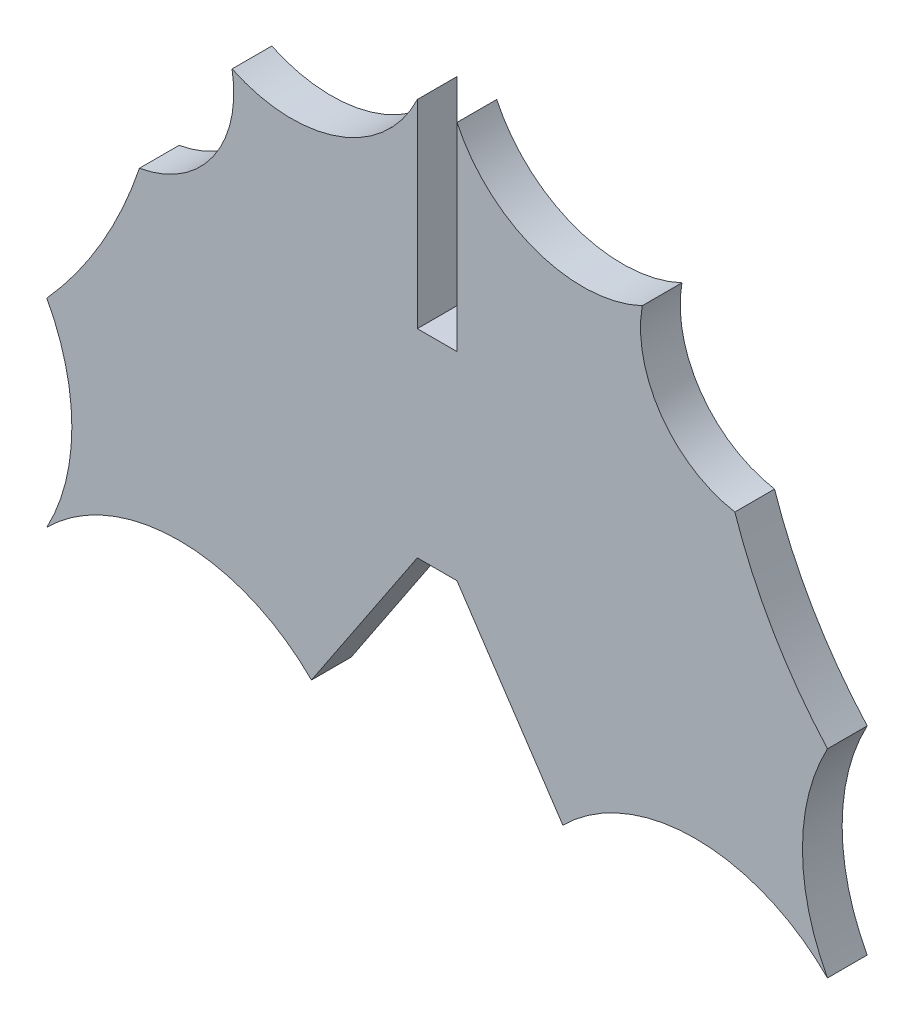
ISO-10303-21;
HEADER;
FILE_DESCRIPTION(('STEP AP214'),'2;1');
FILE_NAME('part.step','',(''),(''),'','','');
FILE_SCHEMA(('AUTOMOTIVE_DESIGN { 1 0 10303 214 1 1 1 1 }'));
ENDSEC;
DATA;
#1=APPLICATION_CONTEXT('core data for automotive mechanical design processes');
#2=APPLICATION_PROTOCOL_DEFINITION('international standard','automotive_design',2000,#1);
#3=PRODUCT_CONTEXT('',#1,'mechanical');
#4=PRODUCT('Part','Part','',(#3));
#5=PRODUCT_RELATED_PRODUCT_CATEGORY('part','',(#4));
#6=PRODUCT_DEFINITION_FORMATION('','',#4);
#7=PRODUCT_DEFINITION_CONTEXT('part definition',#1,'design');
#8=PRODUCT_DEFINITION('design','',#6,#7);
#9=PRODUCT_DEFINITION_SHAPE('','',#8);
#10=(LENGTH_UNIT() NAMED_UNIT(*) SI_UNIT(.MILLI.,.METRE.));
#11=(NAMED_UNIT(*) PLANE_ANGLE_UNIT() SI_UNIT($,.RADIAN.));
#12=(NAMED_UNIT(*) SI_UNIT($,.STERADIAN.) SOLID_ANGLE_UNIT());
#13=UNCERTAINTY_MEASURE_WITH_UNIT(LENGTH_MEASURE(1.E-05),#10,'distance_accuracy_value','');
#14=(GEOMETRIC_REPRESENTATION_CONTEXT(3) GLOBAL_UNCERTAINTY_ASSIGNED_CONTEXT((#13)) GLOBAL_UNIT_ASSIGNED_CONTEXT((#10,
#11,#12)) REPRESENTATION_CONTEXT('',''));
#15=CARTESIAN_POINT('',(0.,0.,0.));
#16=DIRECTION('',(0.,0.,1.));
#17=DIRECTION('',(1.,0.,0.));
#18=AXIS2_PLACEMENT_3D('',#15,#16,#17);
#19=CARTESIAN_POINT('',(-7.01661778192691,0.,3.));
#20=DIRECTION('',(1.,0.,0.));
#21=DIRECTION('',(0.,1.,0.));
#22=AXIS2_PLACEMENT_3D('',#19,#20,#21);
#23=PLANE('',#22);
#24=DIRECTION('',(0.,0.,-1.));
#25=VECTOR('',#24,1.);
#26=CARTESIAN_POINT('',(-7.01661778192691,12.6227024904081,3.));
#27=LINE('',#26,#25);
#28=CARTESIAN_POINT('',(-7.01661778192691,12.6227024904081,3.));
#29=VERTEX_POINT('',#28);
#30=CARTESIAN_POINT('',(-7.01661778192691,12.6227024904081,0.));
#31=VERTEX_POINT('',#30);
#32=EDGE_CURVE('E12',#29,#31,#27,.T.);
#33=ORIENTED_EDGE('',*,*,#32,.F.);
#34=DIRECTION('',(0.,-1.,0.));
#35=VECTOR('',#34,1.);
#36=CARTESIAN_POINT('',(-7.01661778192691,0.,3.));
#37=LINE('',#36,#35);
#38=CARTESIAN_POINT('',(-7.01661778192691,27.6227024904081,3.));
#39=VERTEX_POINT('',#38);
#40=EDGE_CURVE('E238',#39,#29,#37,.T.);
#41=ORIENTED_EDGE('',*,*,#40,.F.);
#42=DIRECTION('',(0.,0.,-1.));
#43=VECTOR('',#42,1.);
#44=CARTESIAN_POINT('',(-7.01661778192691,27.6227024904081,3.));
#45=LINE('',#44,#43);
#46=CARTESIAN_POINT('',(-7.01661778192691,27.6227024904081,0.));
#47=VERTEX_POINT('',#46);
#48=EDGE_CURVE('E273',#39,#47,#45,.T.);
#49=ORIENTED_EDGE('',*,*,#48,.T.);
#50=DIRECTION('',(0.,-1.,0.));
#51=VECTOR('',#50,1.);
#52=CARTESIAN_POINT('',(-7.01661778192691,0.,0.));
#53=LINE('',#52,#51);
#54=EDGE_CURVE('E252',#47,#31,#53,.T.);
#55=ORIENTED_EDGE('',*,*,#54,.T.);
#56=EDGE_LOOP('',(#33,#41,#49,#55));
#57=FACE_BOUND('',#56,.T.);
#58=ADVANCED_FACE('F104',(#57),#23,.F.);
#59=CARTESIAN_POINT('',(10.9833822180731,-24.3772975095919,3.));
#60=DIRECTION('',(0.,0.,-1.));
#61=DIRECTION('',(-1.,0.,0.));
#62=AXIS2_PLACEMENT_3D('',#59,#60,#61);
#63=CYLINDRICAL_SURFACE('',#62,14.142135623731);
#64=CARTESIAN_POINT('',(10.9833822180731,-24.3772975095919,0.));
#65=DIRECTION('',(0.,0.,1.));
#66=DIRECTION('',(1.,0.,0.));
#67=AXIS2_PLACEMENT_3D('',#64,#65,#66);
#68=CIRCLE('',#67,14.142135623731);
#69=CARTESIAN_POINT('',(20.9833822180731,-14.3772975095919,0.));
#70=VERTEX_POINT('',#69);
#71=CARTESIAN_POINT('',(0.98338221807309,-14.3772975095918,0.));
#72=VERTEX_POINT('',#71);
#73=EDGE_CURVE('E265',#70,#72,#68,.T.);
#74=ORIENTED_EDGE('',*,*,#73,.F.);
#75=DIRECTION('',(0.,0.,-1.));
#76=VECTOR('',#75,1.);
#77=CARTESIAN_POINT('',(20.9833822180731,-14.3772975095919,3.));
#78=LINE('',#77,#76);
#79=CARTESIAN_POINT('',(20.9833822180731,-14.3772975095919,3.));
#80=VERTEX_POINT('',#79);
#81=EDGE_CURVE('E111',#80,#70,#78,.T.);
#82=ORIENTED_EDGE('',*,*,#81,.F.);
#83=CARTESIAN_POINT('',(10.9833822180731,-24.3772975095919,3.));
#84=DIRECTION('',(0.,0.,1.));
#85=DIRECTION('',(1.,0.,0.));
#86=AXIS2_PLACEMENT_3D('',#83,#84,#85);
#87=CIRCLE('',#86,14.142135623731);
#88=CARTESIAN_POINT('',(0.98338221807309,-14.3772975095918,3.));
#89=VERTEX_POINT('',#88);
#90=EDGE_CURVE('E237',#80,#89,#87,.T.);
#91=ORIENTED_EDGE('',*,*,#90,.T.);
#92=DIRECTION('',(0.,0.,-1.));
#93=VECTOR('',#92,1.);
#94=CARTESIAN_POINT('',(0.98338221807309,-14.3772975095918,3.));
#95=LINE('',#94,#93);
#96=EDGE_CURVE('E208',#89,#72,#95,.T.);
#97=ORIENTED_EDGE('',*,*,#96,.T.);
#98=EDGE_LOOP('',(#74,#82,#91,#97));
#99=FACE_BOUND('',#98,.T.);
#100=ADVANCED_FACE('F246',(#99),#63,.F.);
#101=CARTESIAN_POINT('',(34.901214334445,-6.87729750959186,3.));
#102=DIRECTION('',(0.,0.,-1.));
#103=DIRECTION('',(-1.,0.,0.));
#104=AXIS2_PLACEMENT_3D('',#101,#102,#103);
#105=CYLINDRICAL_SURFACE('',#104,15.8099984446398);
#106=CARTESIAN_POINT('',(34.901214334445,-6.87729750959186,0.));
#107=DIRECTION('',(0.,0.,1.));
#108=DIRECTION('',(1.,0.,0.));
#109=AXIS2_PLACEMENT_3D('',#106,#107,#108);
#110=CIRCLE('',#109,15.8099984446398);
#111=CARTESIAN_POINT('',(20.9833822180731,0.622702490408147,0.));
#112=VERTEX_POINT('',#111);
#113=EDGE_CURVE('E262',#70,#112,#110,.F.);
#114=ORIENTED_EDGE('',*,*,#113,.T.);
#115=DIRECTION('',(0.,0.,-1.));
#116=VECTOR('',#115,1.);
#117=CARTESIAN_POINT('',(20.9833822180731,0.622702490408147,3.));
#118=LINE('',#117,#116);
#119=CARTESIAN_POINT('',(20.9833822180731,0.622702490408147,3.));
#120=VERTEX_POINT('',#119);
#121=EDGE_CURVE('E284',#120,#112,#118,.T.);
#122=ORIENTED_EDGE('',*,*,#121,.F.);
#123=CARTESIAN_POINT('',(34.901214334445,-6.87729750959186,3.));
#124=DIRECTION('',(0.,0.,1.));
#125=DIRECTION('',(1.,0.,0.));
#126=AXIS2_PLACEMENT_3D('',#123,#124,#125);
#127=CIRCLE('',#126,15.8099984446398);
#128=EDGE_CURVE('E250',#80,#120,#127,.F.);
#129=ORIENTED_EDGE('',*,*,#128,.F.);
#130=ORIENTED_EDGE('',*,*,#81,.T.);
#131=EDGE_LOOP('',(#114,#122,#129,#130));
#132=FACE_BOUND('',#131,.T.);
#133=ADVANCED_FACE('F370',(#132),#105,.F.);
#134=CARTESIAN_POINT('',(46.434231189078,23.5106977234943,3.));
#135=DIRECTION('',(0.,0.,-1.));
#136=DIRECTION('',(-1.,0.,0.));
#137=AXIS2_PLACEMENT_3D('',#134,#135,#136);
#138=CYLINDRICAL_SURFACE('',#137,34.2287311937599);
#139=CARTESIAN_POINT('',(46.434231189078,23.5106977234943,0.));
#140=DIRECTION('',(0.,0.,1.));
#141=DIRECTION('',(1.,0.,0.));
#142=AXIS2_PLACEMENT_3D('',#139,#140,#141);
#143=CIRCLE('',#142,34.2287311937599);
#144=CARTESIAN_POINT('',(13.9833822180731,12.6227024904081,0.));
#145=VERTEX_POINT('',#144);
#146=EDGE_CURVE('E266',#112,#145,#143,.F.);
#147=ORIENTED_EDGE('',*,*,#146,.T.);
#148=DIRECTION('',(0.,0.,-1.));
#149=VECTOR('',#148,1.);
#150=CARTESIAN_POINT('',(13.9833822180731,12.6227024904081,3.));
#151=LINE('',#150,#149);
#152=CARTESIAN_POINT('',(13.9833822180731,12.6227024904081,3.));
#153=VERTEX_POINT('',#152);
#154=EDGE_CURVE('E278',#153,#145,#151,.T.);
#155=ORIENTED_EDGE('',*,*,#154,.F.);
#156=CARTESIAN_POINT('',(46.434231189078,23.5106977234943,3.));
#157=DIRECTION('',(0.,0.,1.));
#158=DIRECTION('',(1.,0.,0.));
#159=AXIS2_PLACEMENT_3D('',#156,#157,#158);
#160=CIRCLE('',#159,34.2287311937599);
#161=EDGE_CURVE('E247',#120,#153,#160,.F.);
#162=ORIENTED_EDGE('',*,*,#161,.F.);
#163=ORIENTED_EDGE('',*,*,#121,.T.);
#164=EDGE_LOOP('',(#147,#155,#162,#163));
#165=FACE_BOUND('',#164,.T.);
#166=ADVANCED_FACE('F364',(#165),#138,.F.);
#167=CARTESIAN_POINT('',(15.4833822180731,21.1227024904082,3.));
#168=DIRECTION('',(0.,0.,-1.));
#169=DIRECTION('',(-1.,0.,0.));
#170=AXIS2_PLACEMENT_3D('',#167,#168,#169);
#171=CYLINDRICAL_SURFACE('',#170,8.63133825081604);
#172=CARTESIAN_POINT('',(15.4833822180731,21.1227024904082,0.));
#173=DIRECTION('',(0.,0.,1.));
#174=DIRECTION('',(1.,0.,0.));
#175=AXIS2_PLACEMENT_3D('',#172,#173,#174);
#176=CIRCLE('',#175,8.63133825081604);
#177=CARTESIAN_POINT('',(6.98338221807309,22.6227024904081,0.));
#178=VERTEX_POINT('',#177);
#179=EDGE_CURVE('E268',#145,#178,#176,.F.);
#180=ORIENTED_EDGE('',*,*,#179,.T.);
#181=DIRECTION('',(0.,0.,-1.));
#182=VECTOR('',#181,1.);
#183=CARTESIAN_POINT('',(6.98338221807309,22.6227024904081,3.));
#184=LINE('',#183,#182);
#185=CARTESIAN_POINT('',(6.98338221807309,22.6227024904081,3.));
#186=VERTEX_POINT('',#185);
#187=EDGE_CURVE('E280',#186,#178,#184,.T.);
#188=ORIENTED_EDGE('',*,*,#187,.F.);
#189=CARTESIAN_POINT('',(15.4833822180731,21.1227024904082,3.));
#190=DIRECTION('',(0.,0.,1.));
#191=DIRECTION('',(1.,0.,0.));
#192=AXIS2_PLACEMENT_3D('',#189,#190,#191);
#193=CIRCLE('',#192,8.63133825081604);
#194=EDGE_CURVE('E258',#153,#186,#193,.F.);
#195=ORIENTED_EDGE('',*,*,#194,.F.);
#196=ORIENTED_EDGE('',*,*,#154,.T.);
#197=EDGE_LOOP('',(#180,#188,#195,#196));
#198=FACE_BOUND('',#197,.T.);
#199=ADVANCED_FACE('F357',(#198),#171,.F.);
#200=CARTESIAN_POINT('',(2.4833822180731,32.1227024904082,3.));
#201=DIRECTION('',(0.,0.,-1.));
#202=DIRECTION('',(-1.,0.,0.));
#203=AXIS2_PLACEMENT_3D('',#200,#201,#202);
#204=CYLINDRICAL_SURFACE('',#203,10.5118980208143);
#205=CARTESIAN_POINT('',(2.4833822180731,32.1227024904082,0.));
#206=DIRECTION('',(0.,0.,1.));
#207=DIRECTION('',(1.,0.,0.));
#208=AXIS2_PLACEMENT_3D('',#205,#206,#207);
#209=CIRCLE('',#208,10.5118980208143);
#210=EDGE_CURVE('E269',#178,#47,#209,.F.);
#211=ORIENTED_EDGE('',*,*,#210,.T.);
#212=ORIENTED_EDGE('',*,*,#48,.F.);
#213=CARTESIAN_POINT('',(2.4833822180731,32.1227024904082,3.));
#214=DIRECTION('',(0.,0.,1.));
#215=DIRECTION('',(1.,0.,0.));
#216=AXIS2_PLACEMENT_3D('',#213,#214,#215);
#217=CIRCLE('',#216,10.5118980208143);
#218=EDGE_CURVE('E256',#186,#39,#217,.F.);
#219=ORIENTED_EDGE('',*,*,#218,.F.);
#220=ORIENTED_EDGE('',*,*,#187,.T.);
#221=EDGE_LOOP('',(#211,#212,#219,#220));
#222=FACE_BOUND('',#221,.T.);
#223=ADVANCED_FACE('F353',(#222),#204,.F.);
#224=CARTESIAN_POINT('',(-5.95487269960718,-3.96991513307146,3.));
#225=DIRECTION('',(0.832050294337843,0.554700196225229,0.));
#226=DIRECTION('',(-0.554700196225229,0.832050294337844,0.));
#227=AXIS2_PLACEMENT_3D('',#224,#225,#226);
#228=PLANE('',#227);
#229=DIRECTION('',(0.554700196225229,-0.832050294337843,0.));
#230=VECTOR('',#229,1.);
#231=CARTESIAN_POINT('',(-5.95487269960718,-3.96991513307146,0.));
#232=LINE('',#231,#230);
#233=CARTESIAN_POINT('',(-7.01661778192691,-2.37729750959186,0.));
#234=VERTEX_POINT('',#233);
#235=EDGE_CURVE('E241',#234,#72,#232,.T.);
#236=ORIENTED_EDGE('',*,*,#235,.T.);
#237=ORIENTED_EDGE('',*,*,#96,.F.);
#238=DIRECTION('',(0.554700196225229,-0.832050294337843,0.));
#239=VECTOR('',#238,1.);
#240=CARTESIAN_POINT('',(-5.95487269960718,-3.96991513307146,3.));
#241=LINE('',#240,#239);
#242=CARTESIAN_POINT('',(-7.01661778192691,-2.37729750959186,3.));
#243=VERTEX_POINT('',#242);
#244=EDGE_CURVE('E233',#243,#89,#241,.T.);
#245=ORIENTED_EDGE('',*,*,#244,.F.);
#246=DIRECTION('',(0.,0.,-1.));
#247=VECTOR('',#246,1.);
#248=CARTESIAN_POINT('',(-7.01661778192691,-2.37729750959186,3.));
#249=LINE('',#248,#247);
#250=EDGE_CURVE('E229',#243,#234,#249,.T.);
#251=ORIENTED_EDGE('',*,*,#250,.T.);
#252=EDGE_LOOP('',(#236,#237,#245,#251));
#253=FACE_BOUND('',#252,.T.);
#254=ADVANCED_FACE('F245',(#253),#228,.F.);
#255=CARTESIAN_POINT('',(0.,0.,3.));
#256=DIRECTION('',(0.,0.,1.));
#257=DIRECTION('',(1.,0.,0.));
#258=AXIS2_PLACEMENT_3D('',#255,#256,#257);
#259=PLANE('',#258);
#260=ORIENTED_EDGE('',*,*,#90,.F.);
#261=ORIENTED_EDGE('',*,*,#128,.T.);
#262=ORIENTED_EDGE('',*,*,#161,.T.);
#263=ORIENTED_EDGE('',*,*,#194,.T.);
#264=ORIENTED_EDGE('',*,*,#218,.T.);
#265=ORIENTED_EDGE('',*,*,#40,.T.);
#266=DIRECTION('',(1.,0.,0.));
#267=VECTOR('',#266,1.);
#268=CARTESIAN_POINT('',(-10.0166177819269,12.6227024904081,3.));
#269=LINE('',#268,#267);
#270=CARTESIAN_POINT('',(-10.0166177819269,12.6227024904081,3.));
#271=VERTEX_POINT('',#270);
#272=EDGE_CURVE('E315',#271,#29,#269,.T.);
#273=ORIENTED_EDGE('',*,*,#272,.F.);
#274=DIRECTION('',(0.,-1.,0.));
#275=VECTOR('',#274,1.);
#276=CARTESIAN_POINT('',(-10.0166177819269,27.6227024904081,3.));
#277=LINE('',#276,#275);
#278=CARTESIAN_POINT('',(-10.0166177819269,27.6227024904081,3.));
#279=VERTEX_POINT('',#278);
#280=EDGE_CURVE('E286',#279,#271,#277,.T.);
#281=ORIENTED_EDGE('',*,*,#280,.F.);
#282=CARTESIAN_POINT('',(-19.5166177819269,32.1227024904082,3.));
#283=DIRECTION('',(0.,0.,1.));
#284=DIRECTION('',(1.,0.,0.));
#285=AXIS2_PLACEMENT_3D('',#282,#283,#284);
#286=CIRCLE('',#285,10.5118980208143);
#287=CARTESIAN_POINT('',(-24.0166177819269,22.6227024904081,3.));
#288=VERTEX_POINT('',#287);
#289=EDGE_CURVE('E303',#288,#279,#286,.T.);
#290=ORIENTED_EDGE('',*,*,#289,.F.);
#291=CARTESIAN_POINT('',(-32.5166177819269,21.1227024904082,3.));
#292=DIRECTION('',(0.,0.,1.));
#293=DIRECTION('',(1.,0.,0.));
#294=AXIS2_PLACEMENT_3D('',#291,#292,#293);
#295=CIRCLE('',#294,8.63133825081604);
#296=CARTESIAN_POINT('',(-31.0166177819269,12.6227024904081,3.));
#297=VERTEX_POINT('',#296);
#298=EDGE_CURVE('E304',#297,#288,#295,.T.);
#299=ORIENTED_EDGE('',*,*,#298,.F.);
#300=CARTESIAN_POINT('',(-63.4674667529318,23.5106977234943,3.));
#301=DIRECTION('',(0.,0.,1.));
#302=DIRECTION('',(1.,0.,0.));
#303=AXIS2_PLACEMENT_3D('',#300,#301,#302);
#304=CIRCLE('',#303,34.2287311937599);
#305=CARTESIAN_POINT('',(-38.0166177819269,0.622702490408147,3.));
#306=VERTEX_POINT('',#305);
#307=EDGE_CURVE('E299',#306,#297,#304,.T.);
#308=ORIENTED_EDGE('',*,*,#307,.F.);
#309=CARTESIAN_POINT('',(-51.9344498982988,-6.87729750959186,3.));
#310=DIRECTION('',(0.,0.,1.));
#311=DIRECTION('',(1.,0.,0.));
#312=AXIS2_PLACEMENT_3D('',#309,#310,#311);
#313=CIRCLE('',#312,15.8099984446398);
#314=CARTESIAN_POINT('',(-38.0166177819269,-14.3772975095919,3.));
#315=VERTEX_POINT('',#314);
#316=EDGE_CURVE('E293',#315,#306,#313,.T.);
#317=ORIENTED_EDGE('',*,*,#316,.F.);
#318=CARTESIAN_POINT('',(-28.0166177819269,-24.3772975095919,3.));
#319=DIRECTION('',(0.,0.,-1.));
#320=DIRECTION('',(-1.,0.,0.));
#321=AXIS2_PLACEMENT_3D('',#318,#319,#320);
#322=CIRCLE('',#321,14.142135623731);
#323=CARTESIAN_POINT('',(-18.0166177819269,-14.3772975095918,3.));
#324=VERTEX_POINT('',#323);
#325=EDGE_CURVE('E291',#315,#324,#322,.T.);
#326=ORIENTED_EDGE('',*,*,#325,.T.);
#327=DIRECTION('',(-0.55470019622523,-0.832050294337844,0.));
#328=VECTOR('',#327,1.);
#329=CARTESIAN_POINT('',(-10.0166177819269,-2.37729750959186,3.));
#330=LINE('',#329,#328);
#331=CARTESIAN_POINT('',(-10.0166177819269,-2.37729750959186,3.));
#332=VERTEX_POINT('',#331);
#333=EDGE_CURVE('E288',#332,#324,#330,.T.);
#334=ORIENTED_EDGE('',*,*,#333,.F.);
#335=DIRECTION('',(1.,0.,0.));
#336=VECTOR('',#335,1.);
#337=CARTESIAN_POINT('',(-10.0166177819269,-2.37729750959186,3.));
#338=LINE('',#337,#336);
#339=EDGE_CURVE('E236',#332,#243,#338,.T.);
#340=ORIENTED_EDGE('',*,*,#339,.T.);
#341=ORIENTED_EDGE('',*,*,#244,.T.);
#342=EDGE_LOOP('',(#260,#261,#262,#263,#264,#265,#273,#281,#290,#299,#308,#317,#326,#334,#340,#341));
#343=FACE_BOUND('',#342,.T.);
#344=ADVANCED_FACE('F232',(#343),#259,.T.);
#345=CARTESIAN_POINT('',(0.,0.,0.));
#346=DIRECTION('',(0.,0.,1.));
#347=DIRECTION('',(1.,0.,0.));
#348=AXIS2_PLACEMENT_3D('',#345,#346,#347);
#349=PLANE('',#348);
#350=ORIENTED_EDGE('',*,*,#73,.T.);
#351=ORIENTED_EDGE('',*,*,#235,.F.);
#352=DIRECTION('',(1.,0.,0.));
#353=VECTOR('',#352,1.);
#354=CARTESIAN_POINT('',(-10.0166177819269,-2.37729750959186,0.));
#355=LINE('',#354,#353);
#356=CARTESIAN_POINT('',(-10.0166177819269,-2.37729750959186,0.));
#357=VERTEX_POINT('',#356);
#358=EDGE_CURVE('E342',#357,#234,#355,.T.);
#359=ORIENTED_EDGE('',*,*,#358,.F.);
#360=DIRECTION('',(-0.55470019622523,-0.832050294337844,0.));
#361=VECTOR('',#360,1.);
#362=CARTESIAN_POINT('',(-10.0166177819269,-2.37729750959186,0.));
#363=LINE('',#362,#361);
#364=CARTESIAN_POINT('',(-18.0166177819269,-14.3772975095918,0.));
#365=VERTEX_POINT('',#364);
#366=EDGE_CURVE('E313',#357,#365,#363,.T.);
#367=ORIENTED_EDGE('',*,*,#366,.T.);
#368=CARTESIAN_POINT('',(-28.0166177819269,-24.3772975095919,0.));
#369=DIRECTION('',(0.,0.,-1.));
#370=DIRECTION('',(-1.,0.,0.));
#371=AXIS2_PLACEMENT_3D('',#368,#369,#370);
#372=CIRCLE('',#371,14.142135623731);
#373=CARTESIAN_POINT('',(-38.0166177819269,-14.3772975095919,0.));
#374=VERTEX_POINT('',#373);
#375=EDGE_CURVE('E312',#374,#365,#372,.T.);
#376=ORIENTED_EDGE('',*,*,#375,.F.);
#377=CARTESIAN_POINT('',(-51.9344498982988,-6.87729750959186,0.));
#378=DIRECTION('',(0.,0.,1.));
#379=DIRECTION('',(1.,0.,0.));
#380=AXIS2_PLACEMENT_3D('',#377,#378,#379);
#381=CIRCLE('',#380,15.8099984446398);
#382=CARTESIAN_POINT('',(-38.0166177819269,0.622702490408147,0.));
#383=VERTEX_POINT('',#382);
#384=EDGE_CURVE('E318',#374,#383,#381,.T.);
#385=ORIENTED_EDGE('',*,*,#384,.T.);
#386=CARTESIAN_POINT('',(-63.4674667529318,23.5106977234943,0.));
#387=DIRECTION('',(0.,0.,1.));
#388=DIRECTION('',(1.,0.,0.));
#389=AXIS2_PLACEMENT_3D('',#386,#387,#388);
#390=CIRCLE('',#389,34.2287311937599);
#391=CARTESIAN_POINT('',(-31.0166177819269,12.6227024904081,0.));
#392=VERTEX_POINT('',#391);
#393=EDGE_CURVE('E321',#383,#392,#390,.T.);
#394=ORIENTED_EDGE('',*,*,#393,.T.);
#395=CARTESIAN_POINT('',(-32.5166177819269,21.1227024904082,0.));
#396=DIRECTION('',(0.,0.,1.));
#397=DIRECTION('',(1.,0.,0.));
#398=AXIS2_PLACEMENT_3D('',#395,#396,#397);
#399=CIRCLE('',#398,8.63133825081604);
#400=CARTESIAN_POINT('',(-24.0166177819269,22.6227024904081,0.));
#401=VERTEX_POINT('',#400);
#402=EDGE_CURVE('E322',#392,#401,#399,.T.);
#403=ORIENTED_EDGE('',*,*,#402,.T.);
#404=CARTESIAN_POINT('',(-19.5166177819269,32.1227024904082,0.));
#405=DIRECTION('',(0.,0.,1.));
#406=DIRECTION('',(1.,0.,0.));
#407=AXIS2_PLACEMENT_3D('',#404,#405,#406);
#408=CIRCLE('',#407,10.5118980208143);
#409=CARTESIAN_POINT('',(-10.0166177819269,27.6227024904081,0.));
#410=VERTEX_POINT('',#409);
#411=EDGE_CURVE('E287',#401,#410,#408,.T.);
#412=ORIENTED_EDGE('',*,*,#411,.T.);
#413=DIRECTION('',(0.,-1.,0.));
#414=VECTOR('',#413,1.);
#415=CARTESIAN_POINT('',(-10.0166177819269,27.6227024904081,0.));
#416=LINE('',#415,#414);
#417=CARTESIAN_POINT('',(-10.0166177819269,12.6227024904081,0.));
#418=VERTEX_POINT('',#417);
#419=EDGE_CURVE('E306',#410,#418,#416,.T.);
#420=ORIENTED_EDGE('',*,*,#419,.T.);
#421=DIRECTION('',(1.,0.,0.));
#422=VECTOR('',#421,1.);
#423=CARTESIAN_POINT('',(-10.0166177819269,12.6227024904081,0.));
#424=LINE('',#423,#422);
#425=EDGE_CURVE('E345',#418,#31,#424,.T.);
#426=ORIENTED_EDGE('',*,*,#425,.T.);
#427=ORIENTED_EDGE('',*,*,#54,.F.);
#428=ORIENTED_EDGE('',*,*,#210,.F.);
#429=ORIENTED_EDGE('',*,*,#179,.F.);
#430=ORIENTED_EDGE('',*,*,#146,.F.);
#431=ORIENTED_EDGE('',*,*,#113,.F.);
#432=EDGE_LOOP('',(#350,#351,#359,#367,#376,#385,#394,#403,#412,#420,#426,#427,#428,#429,#430,#431));
#433=FACE_BOUND('',#432,.T.);
#434=ADVANCED_FACE('F348',(#433),#349,.F.);
#435=CARTESIAN_POINT('',(-28.0166177819269,-24.3772975095919,3.));
#436=DIRECTION('',(0.,0.,-1.));
#437=DIRECTION('',(-1.,0.,0.));
#438=AXIS2_PLACEMENT_3D('',#435,#436,#437);
#439=CYLINDRICAL_SURFACE('',#438,14.142135623731);
#440=ORIENTED_EDGE('',*,*,#375,.T.);
#441=DIRECTION('',(0.,0.,-1.));
#442=VECTOR('',#441,1.);
#443=CARTESIAN_POINT('',(-18.0166177819269,-14.3772975095918,3.));
#444=LINE('',#443,#442);
#445=EDGE_CURVE('E336',#324,#365,#444,.T.);
#446=ORIENTED_EDGE('',*,*,#445,.F.);
#447=ORIENTED_EDGE('',*,*,#325,.F.);
#448=DIRECTION('',(0.,0.,-1.));
#449=VECTOR('',#448,1.);
#450=CARTESIAN_POINT('',(-38.0166177819269,-14.3772975095919,3.));
#451=LINE('',#450,#449);
#452=EDGE_CURVE('E340',#315,#374,#451,.T.);
#453=ORIENTED_EDGE('',*,*,#452,.T.);
#454=EDGE_LOOP('',(#440,#446,#447,#453));
#455=FACE_BOUND('',#454,.T.);
#456=ADVANCED_FACE('F376',(#455),#439,.F.);
#457=CARTESIAN_POINT('',(-51.9344498982988,-6.87729750959186,3.));
#458=DIRECTION('',(0.,0.,-1.));
#459=DIRECTION('',(-1.,0.,0.));
#460=AXIS2_PLACEMENT_3D('',#457,#458,#459);
#461=CYLINDRICAL_SURFACE('',#460,15.8099984446398);
#462=ORIENTED_EDGE('',*,*,#384,.F.);
#463=ORIENTED_EDGE('',*,*,#452,.F.);
#464=ORIENTED_EDGE('',*,*,#316,.T.);
#465=DIRECTION('',(0.,0.,-1.));
#466=VECTOR('',#465,1.);
#467=CARTESIAN_POINT('',(-38.0166177819269,0.622702490408147,3.));
#468=LINE('',#467,#466);
#469=EDGE_CURVE('E333',#306,#383,#468,.T.);
#470=ORIENTED_EDGE('',*,*,#469,.T.);
#471=EDGE_LOOP('',(#462,#463,#464,#470));
#472=FACE_BOUND('',#471,.T.);
#473=ADVANCED_FACE('F377',(#472),#461,.F.);
#474=CARTESIAN_POINT('',(-63.4674667529318,23.5106977234943,3.));
#475=DIRECTION('',(0.,0.,-1.));
#476=DIRECTION('',(-1.,0.,0.));
#477=AXIS2_PLACEMENT_3D('',#474,#475,#476);
#478=CYLINDRICAL_SURFACE('',#477,34.2287311937599);
#479=ORIENTED_EDGE('',*,*,#393,.F.);
#480=ORIENTED_EDGE('',*,*,#469,.F.);
#481=ORIENTED_EDGE('',*,*,#307,.T.);
#482=DIRECTION('',(0.,0.,-1.));
#483=VECTOR('',#482,1.);
#484=CARTESIAN_POINT('',(-31.0166177819269,12.6227024904081,3.));
#485=LINE('',#484,#483);
#486=EDGE_CURVE('E334',#297,#392,#485,.T.);
#487=ORIENTED_EDGE('',*,*,#486,.T.);
#488=EDGE_LOOP('',(#479,#480,#481,#487));
#489=FACE_BOUND('',#488,.T.);
#490=ADVANCED_FACE('F383',(#489),#478,.F.);
#491=CARTESIAN_POINT('',(-32.5166177819269,21.1227024904082,3.));
#492=DIRECTION('',(0.,0.,-1.));
#493=DIRECTION('',(-1.,0.,0.));
#494=AXIS2_PLACEMENT_3D('',#491,#492,#493);
#495=CYLINDRICAL_SURFACE('',#494,8.63133825081604);
#496=ORIENTED_EDGE('',*,*,#402,.F.);
#497=ORIENTED_EDGE('',*,*,#486,.F.);
#498=ORIENTED_EDGE('',*,*,#298,.T.);
#499=DIRECTION('',(0.,0.,-1.));
#500=VECTOR('',#499,1.);
#501=CARTESIAN_POINT('',(-24.0166177819269,22.6227024904081,3.));
#502=LINE('',#501,#500);
#503=EDGE_CURVE('E332',#288,#401,#502,.T.);
#504=ORIENTED_EDGE('',*,*,#503,.T.);
#505=EDGE_LOOP('',(#496,#497,#498,#504));
#506=FACE_BOUND('',#505,.T.);
#507=ADVANCED_FACE('F401',(#506),#495,.F.);
#508=CARTESIAN_POINT('',(-19.5166177819269,32.1227024904082,3.));
#509=DIRECTION('',(0.,0.,-1.));
#510=DIRECTION('',(-1.,0.,0.));
#511=AXIS2_PLACEMENT_3D('',#508,#509,#510);
#512=CYLINDRICAL_SURFACE('',#511,10.5118980208143);
#513=ORIENTED_EDGE('',*,*,#411,.F.);
#514=ORIENTED_EDGE('',*,*,#503,.F.);
#515=ORIENTED_EDGE('',*,*,#289,.T.);
#516=DIRECTION('',(0.,0.,-1.));
#517=VECTOR('',#516,1.);
#518=CARTESIAN_POINT('',(-10.0166177819269,27.6227024904081,3.));
#519=LINE('',#518,#517);
#520=EDGE_CURVE('E328',#279,#410,#519,.T.);
#521=ORIENTED_EDGE('',*,*,#520,.T.);
#522=EDGE_LOOP('',(#513,#514,#515,#521));
#523=FACE_BOUND('',#522,.T.);
#524=ADVANCED_FACE('F386',(#523),#512,.F.);
#525=CARTESIAN_POINT('',(-10.0166177819269,-2.37729750959186,3.));
#526=DIRECTION('',(0.832050294337843,-0.554700196225229,0.));
#527=DIRECTION('',(0.554700196225229,0.832050294337843,0.));
#528=AXIS2_PLACEMENT_3D('',#525,#526,#527);
#529=PLANE('',#528);
#530=ORIENTED_EDGE('',*,*,#366,.F.);
#531=DIRECTION('',(0.,0.,-1.));
#532=VECTOR('',#531,1.);
#533=CARTESIAN_POINT('',(-10.0166177819269,-2.37729750959186,3.));
#534=LINE('',#533,#532);
#535=EDGE_CURVE('E307',#332,#357,#534,.T.);
#536=ORIENTED_EDGE('',*,*,#535,.F.);
#537=ORIENTED_EDGE('',*,*,#333,.T.);
#538=ORIENTED_EDGE('',*,*,#445,.T.);
#539=EDGE_LOOP('',(#530,#536,#537,#538));
#540=FACE_BOUND('',#539,.T.);
#541=ADVANCED_FACE('F375',(#540),#529,.T.);
#542=CARTESIAN_POINT('',(-10.0166177819269,-2.37729750959186,3.));
#543=DIRECTION('',(0.,1.,0.));
#544=DIRECTION('',(0.,0.,1.));
#545=AXIS2_PLACEMENT_3D('',#542,#543,#544);
#546=PLANE('',#545);
#547=ORIENTED_EDGE('',*,*,#358,.T.);
#548=ORIENTED_EDGE('',*,*,#250,.F.);
#549=ORIENTED_EDGE('',*,*,#339,.F.);
#550=ORIENTED_EDGE('',*,*,#535,.T.);
#551=EDGE_LOOP('',(#547,#548,#549,#550));
#552=FACE_BOUND('',#551,.T.);
#553=ADVANCED_FACE('F110',(#552),#546,.F.);
#554=CARTESIAN_POINT('',(-10.0166177819269,27.6227024904081,3.));
#555=DIRECTION('',(1.,0.,0.));
#556=DIRECTION('',(0.,1.,0.));
#557=AXIS2_PLACEMENT_3D('',#554,#555,#556);
#558=PLANE('',#557);
#559=ORIENTED_EDGE('',*,*,#280,.T.);
#560=DIRECTION('',(0.,0.,-1.));
#561=VECTOR('',#560,1.);
#562=CARTESIAN_POINT('',(-10.0166177819269,12.6227024904081,3.));
#563=LINE('',#562,#561);
#564=EDGE_CURVE('E174',#271,#418,#563,.T.);
#565=ORIENTED_EDGE('',*,*,#564,.T.);
#566=ORIENTED_EDGE('',*,*,#419,.F.);
#567=ORIENTED_EDGE('',*,*,#520,.F.);
#568=EDGE_LOOP('',(#559,#565,#566,#567));
#569=FACE_BOUND('',#568,.T.);
#570=ADVANCED_FACE('F395',(#569),#558,.T.);
#571=CARTESIAN_POINT('',(-10.0166177819269,12.6227024904081,3.));
#572=DIRECTION('',(0.,1.,0.));
#573=DIRECTION('',(0.,0.,1.));
#574=AXIS2_PLACEMENT_3D('',#571,#572,#573);
#575=PLANE('',#574);
#576=ORIENTED_EDGE('',*,*,#425,.F.);
#577=ORIENTED_EDGE('',*,*,#564,.F.);
#578=ORIENTED_EDGE('',*,*,#272,.T.);
#579=ORIENTED_EDGE('',*,*,#32,.T.);
#580=EDGE_LOOP('',(#576,#577,#578,#579));
#581=FACE_BOUND('',#580,.T.);
#582=ADVANCED_FACE('F391',(#581),#575,.T.);
#583=CLOSED_SHELL('',(#58,#100,#133,#166,#199,#223,#254,#344,#434,#456,#473,#490,#507,#524,#541,
#553,#570,#582));
#584=MANIFOLD_SOLID_BREP('B2',#583);
#585=ADVANCED_BREP_SHAPE_REPRESENTATION('',(#18,#584),#14);
#586=SHAPE_DEFINITION_REPRESENTATION(#9,#585);
ENDSEC;
END-ISO-10303-21;
